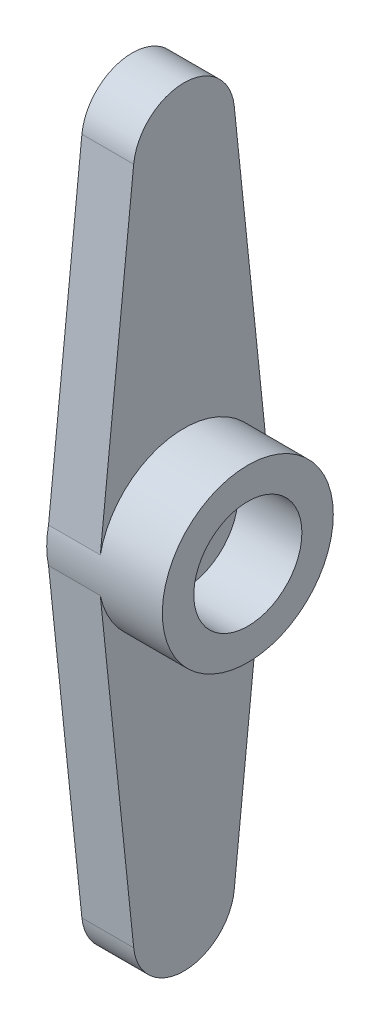
ISO-10303-21;
HEADER;
FILE_DESCRIPTION(('STEP AP214'),'2;1');
FILE_NAME('part.step','',(''),(''),'','','');
FILE_SCHEMA(('AUTOMOTIVE_DESIGN { 1 0 10303 214 1 1 1 1 }'));
ENDSEC;
DATA;
#1=APPLICATION_CONTEXT('core data for automotive mechanical design processes');
#2=APPLICATION_PROTOCOL_DEFINITION('international standard','automotive_design',2000,#1);
#3=PRODUCT_CONTEXT('',#1,'mechanical');
#4=PRODUCT('Part','Part','',(#3));
#5=PRODUCT_RELATED_PRODUCT_CATEGORY('part','',(#4));
#6=PRODUCT_DEFINITION_FORMATION('','',#4);
#7=PRODUCT_DEFINITION_CONTEXT('part definition',#1,'design');
#8=PRODUCT_DEFINITION('design','',#6,#7);
#9=PRODUCT_DEFINITION_SHAPE('','',#8);
#10=(LENGTH_UNIT() NAMED_UNIT(*) SI_UNIT(.MILLI.,.METRE.));
#11=(NAMED_UNIT(*) PLANE_ANGLE_UNIT() SI_UNIT($,.RADIAN.));
#12=(NAMED_UNIT(*) SI_UNIT($,.STERADIAN.) SOLID_ANGLE_UNIT());
#13=UNCERTAINTY_MEASURE_WITH_UNIT(LENGTH_MEASURE(1.E-05),#10,'distance_accuracy_value','');
#14=(GEOMETRIC_REPRESENTATION_CONTEXT(3) GLOBAL_UNCERTAINTY_ASSIGNED_CONTEXT((#13)) GLOBAL_UNIT_ASSIGNED_CONTEXT((#10,
#11,#12)) REPRESENTATION_CONTEXT('',''));
#15=CARTESIAN_POINT('',(0.,0.,0.));
#16=DIRECTION('',(0.,0.,1.));
#17=DIRECTION('',(1.,0.,0.));
#18=AXIS2_PLACEMENT_3D('',#15,#16,#17);
#19=CARTESIAN_POINT('',(5.842,0.,0.));
#20=DIRECTION('',(-1.,0.,0.));
#21=DIRECTION('',(0.,0.,1.));
#22=AXIS2_PLACEMENT_3D('',#19,#20,#21);
#23=CYLINDRICAL_SURFACE('',#22,4.318);
#24=CARTESIAN_POINT('',(2.6162,0.,0.));
#25=DIRECTION('',(1.,0.,0.));
#26=DIRECTION('',(0.,0.,1.));
#27=AXIS2_PLACEMENT_3D('',#24,#25,#26);
#28=CIRCLE('',#27,4.318);
#29=CARTESIAN_POINT('',(2.6162,-0.886266440516038,4.22606859816722));
#30=VERTEX_POINT('',#29);
#31=CARTESIAN_POINT('',(2.6162,-0.886266440516038,-4.22606859816722));
#32=VERTEX_POINT('',#31);
#33=EDGE_CURVE('E54',#30,#32,#28,.T.);
#34=ORIENTED_EDGE('',*,*,#33,.T.);
#35=DIRECTION('',(-1.,0.,0.));
#36=VECTOR('',#35,1.);
#37=CARTESIAN_POINT('',(2.6162,-0.886266440516038,-4.22606859816722));
#38=LINE('',#37,#36);
#39=CARTESIAN_POINT('',(0.,-0.886266440516038,-4.22606859816722));
#40=VERTEX_POINT('',#39);
#41=EDGE_CURVE('E135',#32,#40,#38,.T.);
#42=ORIENTED_EDGE('',*,*,#41,.T.);
#43=CARTESIAN_POINT('',(0.,0.,0.));
#44=DIRECTION('',(1.,0.,0.));
#45=DIRECTION('',(0.,0.,-1.));
#46=AXIS2_PLACEMENT_3D('',#43,#44,#45);
#47=CIRCLE('',#46,4.318);
#48=CARTESIAN_POINT('',(0.,0.886266440516019,-4.22606859816722));
#49=VERTEX_POINT('',#48);
#50=EDGE_CURVE('E158',#40,#49,#47,.T.);
#51=ORIENTED_EDGE('',*,*,#50,.T.);
#52=DIRECTION('',(-1.,0.,0.));
#53=VECTOR('',#52,1.);
#54=CARTESIAN_POINT('',(2.6162,0.886266440516038,-4.22606859816722));
#55=LINE('',#54,#53);
#56=CARTESIAN_POINT('',(2.6162,0.886266440516038,-4.22606859816722));
#57=VERTEX_POINT('',#56);
#58=EDGE_CURVE('E162',#57,#49,#55,.T.);
#59=ORIENTED_EDGE('',*,*,#58,.F.);
#60=CARTESIAN_POINT('',(2.6162,0.,0.));
#61=DIRECTION('',(-1.,0.,0.));
#62=DIRECTION('',(0.,0.,1.));
#63=AXIS2_PLACEMENT_3D('',#60,#61,#62);
#64=CIRCLE('',#63,4.318);
#65=CARTESIAN_POINT('',(2.6162,0.886266440516038,4.22606859816722));
#66=VERTEX_POINT('',#65);
#67=EDGE_CURVE('E143',#66,#57,#64,.T.);
#68=ORIENTED_EDGE('',*,*,#67,.F.);
#69=DIRECTION('',(-1.,0.,0.));
#70=VECTOR('',#69,1.);
#71=CARTESIAN_POINT('',(2.6162,0.886266440516038,4.22606859816722));
#72=LINE('',#71,#70);
#73=CARTESIAN_POINT('',(0.,0.886266440516038,4.22606859816722));
#74=VERTEX_POINT('',#73);
#75=EDGE_CURVE('E159',#66,#74,#72,.T.);
#76=ORIENTED_EDGE('',*,*,#75,.T.);
#77=CARTESIAN_POINT('',(0.,-0.886266440516019,4.22606859816722));
#78=VERTEX_POINT('',#77);
#79=EDGE_CURVE('E38',#74,#78,#47,.T.);
#80=ORIENTED_EDGE('',*,*,#79,.T.);
#81=DIRECTION('',(-1.,0.,0.));
#82=VECTOR('',#81,1.);
#83=CARTESIAN_POINT('',(2.6162,-0.886266440516038,4.22606859816722));
#84=LINE('',#83,#82);
#85=EDGE_CURVE('E49',#30,#78,#84,.T.);
#86=ORIENTED_EDGE('',*,*,#85,.F.);
#87=EDGE_LOOP('',(#34,#42,#51,#59,#68,#76,#80,#86));
#88=FACE_BOUND('',#87,.T.);
#89=CARTESIAN_POINT('',(5.842,0.,0.));
#90=DIRECTION('',(1.,0.,0.));
#91=DIRECTION('',(0.,0.,-1.));
#92=AXIS2_PLACEMENT_3D('',#89,#90,#91);
#93=CIRCLE('',#92,4.318);
#94=CARTESIAN_POINT('',(5.842,0.,-4.318));
#95=VERTEX_POINT('',#94);
#96=EDGE_CURVE('E11',#95,#95,#93,.T.);
#97=ORIENTED_EDGE('',*,*,#96,.F.);
#98=EDGE_LOOP('',(#97));
#99=FACE_BOUND('',#98,.T.);
#100=ADVANCED_FACE('F35',(#88,#99),#23,.T.);
#101=CARTESIAN_POINT('',(5.842,0.,0.));
#102=DIRECTION('',(1.,0.,0.));
#103=DIRECTION('',(0.,0.,-1.));
#104=AXIS2_PLACEMENT_3D('',#101,#102,#103);
#105=PLANE('',#104);
#106=CARTESIAN_POINT('',(5.842,0.,0.));
#107=DIRECTION('',(1.,0.,0.));
#108=DIRECTION('',(0.,0.,-1.));
#109=AXIS2_PLACEMENT_3D('',#106,#107,#108);
#110=CIRCLE('',#109,2.7305);
#111=CARTESIAN_POINT('',(5.842,0.,-2.7305));
#112=VERTEX_POINT('',#111);
#113=EDGE_CURVE('E124',#112,#112,#110,.T.);
#114=ORIENTED_EDGE('',*,*,#113,.F.);
#115=EDGE_LOOP('',(#114));
#116=FACE_BOUND('',#115,.T.);
#117=ORIENTED_EDGE('',*,*,#96,.T.);
#118=EDGE_LOOP('',(#117));
#119=FACE_BOUND('',#118,.T.);
#120=ADVANCED_FACE('F199',(#116,#119),#105,.T.);
#121=CARTESIAN_POINT('',(0.,0.,0.));
#122=DIRECTION('',(1.,0.,0.));
#123=DIRECTION('',(0.,0.,-1.));
#124=AXIS2_PLACEMENT_3D('',#121,#122,#123);
#125=PLANE('',#124);
#126=ORIENTED_EDGE('',*,*,#79,.F.);
#127=DIRECTION('',(0.,0.994663190809051,-0.10317527247145));
#128=VECTOR('',#127,1.);
#129=CARTESIAN_POINT('',(0.,0.44313322025802,4.27203429908361));
#130=LINE('',#129,#128);
#131=CARTESIAN_POINT('',(0.,17.1408430614793,2.54));
#132=VERTEX_POINT('',#131);
#133=EDGE_CURVE('E141',#74,#132,#130,.T.);
#134=ORIENTED_EDGE('',*,*,#133,.T.);
#135=CARTESIAN_POINT('',(0.,16.8773717734101,0.));
#136=DIRECTION('',(-1.,0.,0.));
#137=DIRECTION('',(0.,0.,1.));
#138=AXIS2_PLACEMENT_3D('',#135,#136,#137);
#139=CIRCLE('',#138,2.55362822658993);
#140=CARTESIAN_POINT('',(0.,17.1408430614793,-2.54));
#141=VERTEX_POINT('',#140);
#142=EDGE_CURVE('E134',#141,#132,#139,.F.);
#143=ORIENTED_EDGE('',*,*,#142,.F.);
#144=DIRECTION('',(0.,0.994663190809051,0.10317527247145));
#145=VECTOR('',#144,1.);
#146=CARTESIAN_POINT('',(0.,0.44313322025802,-4.27203429908361));
#147=LINE('',#146,#145);
#148=EDGE_CURVE('E152',#49,#141,#147,.T.);
#149=ORIENTED_EDGE('',*,*,#148,.F.);
#150=ORIENTED_EDGE('',*,*,#50,.F.);
#151=DIRECTION('',(0.,-0.994663190809051,0.10317527247145));
#152=VECTOR('',#151,1.);
#153=CARTESIAN_POINT('',(0.,-0.44313322025802,-4.27203429908361));
#154=LINE('',#153,#152);
#155=CARTESIAN_POINT('',(0.,-17.1408430614793,-2.54));
#156=VERTEX_POINT('',#155);
#157=EDGE_CURVE('E119',#40,#156,#154,.T.);
#158=ORIENTED_EDGE('',*,*,#157,.T.);
#159=CARTESIAN_POINT('',(0.,-16.8773717734101,0.));
#160=DIRECTION('',(1.,0.,0.));
#161=DIRECTION('',(0.,0.,1.));
#162=AXIS2_PLACEMENT_3D('',#159,#160,#161);
#163=CIRCLE('',#162,2.55362822658993);
#164=CARTESIAN_POINT('',(0.,-17.1408430614793,2.54));
#165=VERTEX_POINT('',#164);
#166=EDGE_CURVE('E129',#156,#165,#163,.F.);
#167=ORIENTED_EDGE('',*,*,#166,.T.);
#168=DIRECTION('',(0.,-0.994663190809051,-0.10317527247145));
#169=VECTOR('',#168,1.);
#170=CARTESIAN_POINT('',(0.,-0.44313322025802,4.27203429908361));
#171=LINE('',#170,#169);
#172=EDGE_CURVE('E111',#78,#165,#171,.T.);
#173=ORIENTED_EDGE('',*,*,#172,.F.);
#174=EDGE_LOOP('',(#126,#134,#143,#149,#150,#158,#167,#173));
#175=FACE_BOUND('',#174,.T.);
#176=ADVANCED_FACE('F176',(#175),#125,.F.);
#177=CARTESIAN_POINT('',(2.6162,16.8773717734101,0.));
#178=DIRECTION('',(-1.,0.,0.));
#179=DIRECTION('',(0.,0.,1.));
#180=AXIS2_PLACEMENT_3D('',#177,#178,#179);
#181=CYLINDRICAL_SURFACE('',#180,2.55362822658993);
#182=ORIENTED_EDGE('',*,*,#142,.T.);
#183=DIRECTION('',(-1.,0.,0.));
#184=VECTOR('',#183,1.);
#185=CARTESIAN_POINT('',(2.6162,17.1408430614793,2.54));
#186=LINE('',#185,#184);
#187=CARTESIAN_POINT('',(2.6162,17.1408430614793,2.54));
#188=VERTEX_POINT('',#187);
#189=EDGE_CURVE('E156',#188,#132,#186,.T.);
#190=ORIENTED_EDGE('',*,*,#189,.F.);
#191=CARTESIAN_POINT('',(2.6162,16.8773717734101,0.));
#192=DIRECTION('',(-1.,0.,0.));
#193=DIRECTION('',(0.,0.,1.));
#194=AXIS2_PLACEMENT_3D('',#191,#192,#193);
#195=CIRCLE('',#194,2.55362822658993);
#196=CARTESIAN_POINT('',(2.6162,17.1408430614793,-2.54));
#197=VERTEX_POINT('',#196);
#198=EDGE_CURVE('E138',#197,#188,#195,.F.);
#199=ORIENTED_EDGE('',*,*,#198,.F.);
#200=DIRECTION('',(-1.,0.,0.));
#201=VECTOR('',#200,1.);
#202=CARTESIAN_POINT('',(2.6162,17.1408430614793,-2.54));
#203=LINE('',#202,#201);
#204=EDGE_CURVE('E149',#197,#141,#203,.T.);
#205=ORIENTED_EDGE('',*,*,#204,.T.);
#206=EDGE_LOOP('',(#182,#190,#199,#205));
#207=FACE_BOUND('',#206,.T.);
#208=ADVANCED_FACE('F170',(#207),#181,.T.);
#209=CARTESIAN_POINT('',(2.6162,0.44313322025802,4.27203429908361));
#210=DIRECTION('',(0.,0.10317527247145,0.994663190809051));
#211=DIRECTION('',(0.,-0.994663190809051,0.10317527247145));
#212=AXIS2_PLACEMENT_3D('',#209,#210,#211);
#213=PLANE('',#212);
#214=ORIENTED_EDGE('',*,*,#133,.F.);
#215=ORIENTED_EDGE('',*,*,#75,.F.);
#216=DIRECTION('',(0.,0.994663190809051,-0.10317527247145));
#217=VECTOR('',#216,1.);
#218=CARTESIAN_POINT('',(2.6162,0.44313322025802,4.27203429908361));
#219=LINE('',#218,#217);
#220=EDGE_CURVE('E146',#66,#188,#219,.T.);
#221=ORIENTED_EDGE('',*,*,#220,.T.);
#222=ORIENTED_EDGE('',*,*,#189,.T.);
#223=EDGE_LOOP('',(#214,#215,#221,#222));
#224=FACE_BOUND('',#223,.T.);
#225=ADVANCED_FACE('F180',(#224),#213,.T.);
#226=CARTESIAN_POINT('',(2.6162,0.44313322025802,-4.27203429908361));
#227=DIRECTION('',(0.,-0.10317527247145,0.994663190809051));
#228=DIRECTION('',(0.,-0.994663190809051,-0.10317527247145));
#229=AXIS2_PLACEMENT_3D('',#226,#227,#228);
#230=PLANE('',#229);
#231=ORIENTED_EDGE('',*,*,#148,.T.);
#232=ORIENTED_EDGE('',*,*,#204,.F.);
#233=DIRECTION('',(0.,0.994663190809051,0.10317527247145));
#234=VECTOR('',#233,1.);
#235=CARTESIAN_POINT('',(2.6162,0.44313322025802,-4.27203429908361));
#236=LINE('',#235,#234);
#237=EDGE_CURVE('E140',#57,#197,#236,.T.);
#238=ORIENTED_EDGE('',*,*,#237,.F.);
#239=ORIENTED_EDGE('',*,*,#58,.T.);
#240=EDGE_LOOP('',(#231,#232,#238,#239));
#241=FACE_BOUND('',#240,.T.);
#242=ADVANCED_FACE('F184',(#241),#230,.F.);
#243=CARTESIAN_POINT('',(2.6162,0.,0.));
#244=DIRECTION('',(-1.,0.,0.));
#245=DIRECTION('',(0.,0.,1.));
#246=AXIS2_PLACEMENT_3D('',#243,#244,#245);
#247=PLANE('',#246);
#248=ORIENTED_EDGE('',*,*,#198,.T.);
#249=ORIENTED_EDGE('',*,*,#220,.F.);
#250=ORIENTED_EDGE('',*,*,#67,.T.);
#251=ORIENTED_EDGE('',*,*,#237,.T.);
#252=EDGE_LOOP('',(#248,#249,#250,#251));
#253=FACE_BOUND('',#252,.T.);
#254=ADVANCED_FACE('F183',(#253),#247,.F.);
#255=CARTESIAN_POINT('',(2.6162,-16.8773717734101,0.));
#256=DIRECTION('',(-1.,0.,0.));
#257=DIRECTION('',(0.,0.,1.));
#258=AXIS2_PLACEMENT_3D('',#255,#256,#257);
#259=CYLINDRICAL_SURFACE('',#258,2.55362822658993);
#260=ORIENTED_EDGE('',*,*,#166,.F.);
#261=DIRECTION('',(-1.,0.,0.));
#262=VECTOR('',#261,1.);
#263=CARTESIAN_POINT('',(2.6162,-17.1408430614793,-2.54));
#264=LINE('',#263,#262);
#265=CARTESIAN_POINT('',(2.6162,-17.1408430614793,-2.54));
#266=VERTEX_POINT('',#265);
#267=EDGE_CURVE('E118',#266,#156,#264,.T.);
#268=ORIENTED_EDGE('',*,*,#267,.F.);
#269=CARTESIAN_POINT('',(2.6162,-16.8773717734101,0.));
#270=DIRECTION('',(1.,0.,0.));
#271=DIRECTION('',(0.,0.,1.));
#272=AXIS2_PLACEMENT_3D('',#269,#270,#271);
#273=CIRCLE('',#272,2.55362822658993);
#274=CARTESIAN_POINT('',(2.6162,-17.1408430614793,2.54));
#275=VERTEX_POINT('',#274);
#276=EDGE_CURVE('E103',#266,#275,#273,.F.);
#277=ORIENTED_EDGE('',*,*,#276,.T.);
#278=DIRECTION('',(-1.,0.,0.));
#279=VECTOR('',#278,1.);
#280=CARTESIAN_POINT('',(2.6162,-17.1408430614793,2.54));
#281=LINE('',#280,#279);
#282=EDGE_CURVE('E108',#275,#165,#281,.T.);
#283=ORIENTED_EDGE('',*,*,#282,.T.);
#284=EDGE_LOOP('',(#260,#268,#277,#283));
#285=FACE_BOUND('',#284,.T.);
#286=ADVANCED_FACE('F117',(#285),#259,.T.);
#287=CARTESIAN_POINT('',(2.6162,-0.44313322025802,-4.27203429908361));
#288=DIRECTION('',(0.,-0.10317527247145,-0.994663190809051));
#289=DIRECTION('',(0.,0.994663190809051,-0.10317527247145));
#290=AXIS2_PLACEMENT_3D('',#287,#288,#289);
#291=PLANE('',#290);
#292=ORIENTED_EDGE('',*,*,#157,.F.);
#293=ORIENTED_EDGE('',*,*,#41,.F.);
#294=DIRECTION('',(0.,-0.994663190809051,0.10317527247145));
#295=VECTOR('',#294,1.);
#296=CARTESIAN_POINT('',(2.6162,-0.44313322025802,-4.27203429908361));
#297=LINE('',#296,#295);
#298=EDGE_CURVE('E115',#32,#266,#297,.T.);
#299=ORIENTED_EDGE('',*,*,#298,.T.);
#300=ORIENTED_EDGE('',*,*,#267,.T.);
#301=EDGE_LOOP('',(#292,#293,#299,#300));
#302=FACE_BOUND('',#301,.T.);
#303=ADVANCED_FACE('F188',(#302),#291,.T.);
#304=CARTESIAN_POINT('',(2.6162,-0.44313322025802,4.27203429908361));
#305=DIRECTION('',(0.,0.10317527247145,-0.994663190809051));
#306=DIRECTION('',(0.,0.994663190809051,0.10317527247145));
#307=AXIS2_PLACEMENT_3D('',#304,#305,#306);
#308=PLANE('',#307);
#309=ORIENTED_EDGE('',*,*,#172,.T.);
#310=ORIENTED_EDGE('',*,*,#282,.F.);
#311=DIRECTION('',(0.,-0.994663190809051,-0.10317527247145));
#312=VECTOR('',#311,1.);
#313=CARTESIAN_POINT('',(2.6162,-0.44313322025802,4.27203429908361));
#314=LINE('',#313,#312);
#315=EDGE_CURVE('E98',#30,#275,#314,.T.);
#316=ORIENTED_EDGE('',*,*,#315,.F.);
#317=ORIENTED_EDGE('',*,*,#85,.T.);
#318=EDGE_LOOP('',(#309,#310,#316,#317));
#319=FACE_BOUND('',#318,.T.);
#320=ADVANCED_FACE('F109',(#319),#308,.F.);
#321=CARTESIAN_POINT('',(2.6162,0.,0.));
#322=DIRECTION('',(-1.,0.,0.));
#323=DIRECTION('',(0.,0.,1.));
#324=AXIS2_PLACEMENT_3D('',#321,#322,#323);
#325=PLANE('',#324);
#326=ORIENTED_EDGE('',*,*,#276,.F.);
#327=ORIENTED_EDGE('',*,*,#298,.F.);
#328=ORIENTED_EDGE('',*,*,#33,.F.);
#329=ORIENTED_EDGE('',*,*,#315,.T.);
#330=EDGE_LOOP('',(#326,#327,#328,#329));
#331=FACE_BOUND('',#330,.T.);
#332=ADVANCED_FACE('F100',(#331),#325,.F.);
#333=CARTESIAN_POINT('',(2.6162,0.,0.));
#334=DIRECTION('',(1.,0.,0.));
#335=DIRECTION('',(0.,0.,-1.));
#336=AXIS2_PLACEMENT_3D('',#333,#334,#335);
#337=CYLINDRICAL_SURFACE('',#336,2.7305);
#338=CARTESIAN_POINT('',(2.6162,0.,0.));
#339=DIRECTION('',(1.,0.,0.));
#340=DIRECTION('',(0.,0.,-1.));
#341=AXIS2_PLACEMENT_3D('',#338,#339,#340);
#342=CIRCLE('',#341,2.7305);
#343=CARTESIAN_POINT('',(2.6162,0.,-2.7305));
#344=VERTEX_POINT('',#343);
#345=EDGE_CURVE('E131',#344,#344,#342,.T.);
#346=ORIENTED_EDGE('',*,*,#345,.F.);
#347=EDGE_LOOP('',(#346));
#348=FACE_BOUND('',#347,.T.);
#349=ORIENTED_EDGE('',*,*,#113,.T.);
#350=EDGE_LOOP('',(#349));
#351=FACE_BOUND('',#350,.T.);
#352=ADVANCED_FACE('F247',(#348,#351),#337,.F.);
#353=CARTESIAN_POINT('',(2.6162,0.,0.));
#354=DIRECTION('',(1.,0.,0.));
#355=DIRECTION('',(0.,0.,-1.));
#356=AXIS2_PLACEMENT_3D('',#353,#354,#355);
#357=PLANE('',#356);
#358=ORIENTED_EDGE('',*,*,#345,.T.);
#359=EDGE_LOOP('',(#358));
#360=FACE_BOUND('',#359,.T.);
#361=ADVANCED_FACE('F262',(#360),#357,.T.);
#362=CLOSED_SHELL('',(#100,#120,#176,#208,#225,#242,#254,#286,#303,#320,#332,#352,#361));
#363=MANIFOLD_SOLID_BREP('B2',#362);
#364=ADVANCED_BREP_SHAPE_REPRESENTATION('',(#18,#363),#14);
#365=SHAPE_DEFINITION_REPRESENTATION(#9,#364);
ENDSEC;
END-ISO-10303-21;
